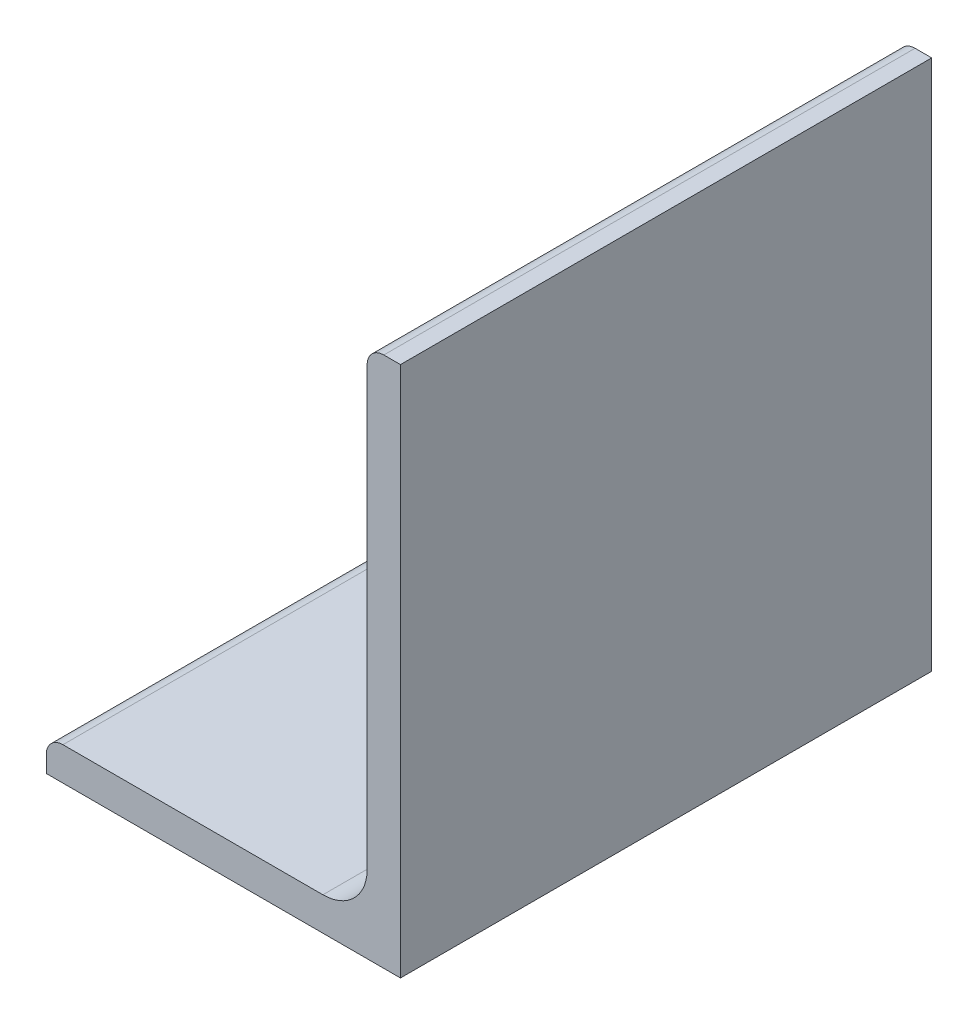
ISO-10303-21;
HEADER;
FILE_DESCRIPTION(('STEP AP214'),'2;1');
FILE_NAME('part.step','',(''),(''),'','','');
FILE_SCHEMA(('AUTOMOTIVE_DESIGN { 1 0 10303 214 1 1 1 1 }'));
ENDSEC;
DATA;
#1=APPLICATION_CONTEXT('core data for automotive mechanical design processes');
#2=APPLICATION_PROTOCOL_DEFINITION('international standard','automotive_design',2000,#1);
#3=PRODUCT_CONTEXT('',#1,'mechanical');
#4=PRODUCT('Part','Part','',(#3));
#5=PRODUCT_RELATED_PRODUCT_CATEGORY('part','',(#4));
#6=PRODUCT_DEFINITION_FORMATION('','',#4);
#7=PRODUCT_DEFINITION_CONTEXT('part definition',#1,'design');
#8=PRODUCT_DEFINITION('design','',#6,#7);
#9=PRODUCT_DEFINITION_SHAPE('','',#8);
#10=(LENGTH_UNIT() NAMED_UNIT(*) SI_UNIT(.MILLI.,.METRE.));
#11=(NAMED_UNIT(*) PLANE_ANGLE_UNIT() SI_UNIT($,.RADIAN.));
#12=(NAMED_UNIT(*) SI_UNIT($,.STERADIAN.) SOLID_ANGLE_UNIT());
#13=UNCERTAINTY_MEASURE_WITH_UNIT(LENGTH_MEASURE(1.E-05),#10,'distance_accuracy_value','');
#14=(GEOMETRIC_REPRESENTATION_CONTEXT(3) GLOBAL_UNCERTAINTY_ASSIGNED_CONTEXT((#13)) GLOBAL_UNIT_ASSIGNED_CONTEXT((#10,
#11,#12)) REPRESENTATION_CONTEXT('',''));
#15=CARTESIAN_POINT('',(0.,0.,0.));
#16=DIRECTION('',(0.,0.,1.));
#17=DIRECTION('',(1.,0.,0.));
#18=AXIS2_PLACEMENT_3D('',#15,#16,#17);
#19=CARTESIAN_POINT('',(-25.4,2.3876,38.1));
#20=DIRECTION('',(1.,0.,0.));
#21=DIRECTION('',(0.,0.,-1.));
#22=AXIS2_PLACEMENT_3D('',#19,#20,#21);
#23=PLANE('',#22);
#24=DIRECTION('',(0.,-1.,0.));
#25=VECTOR('',#24,1.);
#26=CARTESIAN_POINT('',(-25.4,2.3876,-38.1));
#27=LINE('',#26,#25);
#28=CARTESIAN_POINT('',(-25.4,2.3876,-38.1));
#29=VERTEX_POINT('',#28);
#30=CARTESIAN_POINT('',(-25.4,0.,-38.1));
#31=VERTEX_POINT('',#30);
#32=EDGE_CURVE('E146',#29,#31,#27,.T.);
#33=ORIENTED_EDGE('',*,*,#32,.T.);
#34=DIRECTION('',(0.,0.,-1.));
#35=VECTOR('',#34,1.);
#36=CARTESIAN_POINT('',(-25.4,0.,38.1));
#37=LINE('',#36,#35);
#38=CARTESIAN_POINT('',(-25.4,0.,38.1));
#39=VERTEX_POINT('',#38);
#40=EDGE_CURVE('E11',#39,#31,#37,.T.);
#41=ORIENTED_EDGE('',*,*,#40,.F.);
#42=DIRECTION('',(0.,-1.,0.));
#43=VECTOR('',#42,1.);
#44=CARTESIAN_POINT('',(-25.4,2.3876,38.1));
#45=LINE('',#44,#43);
#46=CARTESIAN_POINT('',(-25.4,2.3876,38.1));
#47=VERTEX_POINT('',#46);
#48=EDGE_CURVE('E171',#47,#39,#45,.T.);
#49=ORIENTED_EDGE('',*,*,#48,.F.);
#50=DIRECTION('',(0.,0.,-1.));
#51=VECTOR('',#50,1.);
#52=CARTESIAN_POINT('',(-25.4,2.3876,38.1));
#53=LINE('',#52,#51);
#54=EDGE_CURVE('E142',#47,#29,#53,.T.);
#55=ORIENTED_EDGE('',*,*,#54,.T.);
#56=EDGE_LOOP('',(#33,#41,#49,#55));
#57=FACE_BOUND('',#56,.T.);
#58=ADVANCED_FACE('F39',(#57),#23,.F.);
#59=CARTESIAN_POINT('',(-25.4,0.,38.1));
#60=DIRECTION('',(0.,1.,0.));
#61=DIRECTION('',(0.,0.,1.));
#62=AXIS2_PLACEMENT_3D('',#59,#60,#61);
#63=PLANE('',#62);
#64=DIRECTION('',(1.,0.,0.));
#65=VECTOR('',#64,1.);
#66=CARTESIAN_POINT('',(-25.4,0.,-38.1));
#67=LINE('',#66,#65);
#68=CARTESIAN_POINT('',(25.4,0.,-38.1));
#69=VERTEX_POINT('',#68);
#70=EDGE_CURVE('E150',#31,#69,#67,.T.);
#71=ORIENTED_EDGE('',*,*,#70,.T.);
#72=DIRECTION('',(0.,0.,-1.));
#73=VECTOR('',#72,1.);
#74=CARTESIAN_POINT('',(25.4,0.,38.1));
#75=LINE('',#74,#73);
#76=CARTESIAN_POINT('',(25.4,0.,38.1));
#77=VERTEX_POINT('',#76);
#78=EDGE_CURVE('E48',#77,#69,#75,.T.);
#79=ORIENTED_EDGE('',*,*,#78,.F.);
#80=DIRECTION('',(1.,0.,0.));
#81=VECTOR('',#80,1.);
#82=CARTESIAN_POINT('',(-25.4,0.,38.1));
#83=LINE('',#82,#81);
#84=EDGE_CURVE('E102',#39,#77,#83,.T.);
#85=ORIENTED_EDGE('',*,*,#84,.F.);
#86=ORIENTED_EDGE('',*,*,#40,.T.);
#87=EDGE_LOOP('',(#71,#79,#85,#86));
#88=FACE_BOUND('',#87,.T.);
#89=ADVANCED_FACE('F227',(#88),#63,.F.);
#90=CARTESIAN_POINT('',(25.4,0.,38.1));
#91=DIRECTION('',(-1.,0.,0.));
#92=DIRECTION('',(0.,0.,1.));
#93=AXIS2_PLACEMENT_3D('',#90,#91,#92);
#94=PLANE('',#93);
#95=DIRECTION('',(0.,1.,0.));
#96=VECTOR('',#95,1.);
#97=CARTESIAN_POINT('',(25.4,0.,-38.1));
#98=LINE('',#97,#96);
#99=CARTESIAN_POINT('',(25.4,76.2,-38.1));
#100=VERTEX_POINT('',#99);
#101=EDGE_CURVE('E153',#69,#100,#98,.T.);
#102=ORIENTED_EDGE('',*,*,#101,.T.);
#103=DIRECTION('',(0.,0.,-1.));
#104=VECTOR('',#103,1.);
#105=CARTESIAN_POINT('',(25.4,76.2,38.1));
#106=LINE('',#105,#104);
#107=CARTESIAN_POINT('',(25.4,76.2,38.1));
#108=VERTEX_POINT('',#107);
#109=EDGE_CURVE('E186',#108,#100,#106,.T.);
#110=ORIENTED_EDGE('',*,*,#109,.F.);
#111=DIRECTION('',(0.,1.,0.));
#112=VECTOR('',#111,1.);
#113=CARTESIAN_POINT('',(25.4,0.,38.1));
#114=LINE('',#113,#112);
#115=EDGE_CURVE('E196',#77,#108,#114,.T.);
#116=ORIENTED_EDGE('',*,*,#115,.F.);
#117=ORIENTED_EDGE('',*,*,#78,.T.);
#118=EDGE_LOOP('',(#102,#110,#116,#117));
#119=FACE_BOUND('',#118,.T.);
#120=ADVANCED_FACE('F194',(#119),#94,.F.);
#121=CARTESIAN_POINT('',(23.0124,76.2,38.1));
#122=DIRECTION('',(0.,-1.,0.));
#123=DIRECTION('',(0.,0.,-1.));
#124=AXIS2_PLACEMENT_3D('',#121,#122,#123);
#125=PLANE('',#124);
#126=DIRECTION('',(-1.,0.,0.));
#127=VECTOR('',#126,1.);
#128=CARTESIAN_POINT('',(23.0124,76.2,-38.1));
#129=LINE('',#128,#127);
#130=CARTESIAN_POINT('',(23.0124,76.2,-38.1));
#131=VERTEX_POINT('',#130);
#132=EDGE_CURVE('E156',#100,#131,#129,.T.);
#133=ORIENTED_EDGE('',*,*,#132,.T.);
#134=DIRECTION('',(0.,0.,-1.));
#135=VECTOR('',#134,1.);
#136=CARTESIAN_POINT('',(23.0124,76.2,38.1));
#137=LINE('',#136,#135);
#138=CARTESIAN_POINT('',(23.0124,76.2,38.1));
#139=VERTEX_POINT('',#138);
#140=EDGE_CURVE('E182',#139,#131,#137,.T.);
#141=ORIENTED_EDGE('',*,*,#140,.F.);
#142=DIRECTION('',(-1.,0.,0.));
#143=VECTOR('',#142,1.);
#144=CARTESIAN_POINT('',(23.0124,76.2,38.1));
#145=LINE('',#144,#143);
#146=EDGE_CURVE('E213',#108,#139,#145,.T.);
#147=ORIENTED_EDGE('',*,*,#146,.F.);
#148=ORIENTED_EDGE('',*,*,#109,.T.);
#149=EDGE_LOOP('',(#133,#141,#147,#148));
#150=FACE_BOUND('',#149,.T.);
#151=ADVANCED_FACE('F205',(#150),#125,.F.);
#152=CARTESIAN_POINT('',(23.0124,73.8124,38.1));
#153=DIRECTION('',(0.,0.,-1.));
#154=DIRECTION('',(-1.,0.,0.));
#155=AXIS2_PLACEMENT_3D('',#152,#153,#154);
#156=CYLINDRICAL_SURFACE('',#155,2.3876);
#157=CARTESIAN_POINT('',(23.0124,73.8124,-38.1));
#158=DIRECTION('',(0.,0.,1.));
#159=DIRECTION('',(-1.,0.,0.));
#160=AXIS2_PLACEMENT_3D('',#157,#158,#159);
#161=CIRCLE('',#160,2.3876);
#162=CARTESIAN_POINT('',(20.6248,73.8124,-38.1));
#163=VERTEX_POINT('',#162);
#164=EDGE_CURVE('E159',#131,#163,#161,.T.);
#165=ORIENTED_EDGE('',*,*,#164,.T.);
#166=DIRECTION('',(0.,0.,-1.));
#167=VECTOR('',#166,1.);
#168=CARTESIAN_POINT('',(20.6248,73.8124,38.1));
#169=LINE('',#168,#167);
#170=CARTESIAN_POINT('',(20.6248,73.8124,38.1));
#171=VERTEX_POINT('',#170);
#172=EDGE_CURVE('E178',#171,#163,#169,.T.);
#173=ORIENTED_EDGE('',*,*,#172,.F.);
#174=CARTESIAN_POINT('',(23.0124,73.8124,38.1));
#175=DIRECTION('',(0.,0.,1.));
#176=DIRECTION('',(-1.,0.,0.));
#177=AXIS2_PLACEMENT_3D('',#174,#175,#176);
#178=CIRCLE('',#177,2.3876);
#179=EDGE_CURVE('E211',#139,#171,#178,.T.);
#180=ORIENTED_EDGE('',*,*,#179,.F.);
#181=ORIENTED_EDGE('',*,*,#140,.T.);
#182=EDGE_LOOP('',(#165,#173,#180,#181));
#183=FACE_BOUND('',#182,.T.);
#184=ADVANCED_FACE('F209',(#183),#156,.T.);
#185=CARTESIAN_POINT('',(20.6248,73.8124,38.1));
#186=DIRECTION('',(1.,0.,0.));
#187=DIRECTION('',(0.,1.,0.));
#188=AXIS2_PLACEMENT_3D('',#185,#186,#187);
#189=PLANE('',#188);
#190=DIRECTION('',(0.,-1.,0.));
#191=VECTOR('',#190,1.);
#192=CARTESIAN_POINT('',(20.6248,73.8124,-38.1));
#193=LINE('',#192,#191);
#194=CARTESIAN_POINT('',(20.6248,11.1252,-38.1));
#195=VERTEX_POINT('',#194);
#196=EDGE_CURVE('E162',#163,#195,#193,.T.);
#197=ORIENTED_EDGE('',*,*,#196,.T.);
#198=DIRECTION('',(0.,0.,-1.));
#199=VECTOR('',#198,1.);
#200=CARTESIAN_POINT('',(20.6248,11.1252,38.1));
#201=LINE('',#200,#199);
#202=CARTESIAN_POINT('',(20.6248,11.1252,38.1));
#203=VERTEX_POINT('',#202);
#204=EDGE_CURVE('E135',#203,#195,#201,.T.);
#205=ORIENTED_EDGE('',*,*,#204,.F.);
#206=DIRECTION('',(0.,-1.,0.));
#207=VECTOR('',#206,1.);
#208=CARTESIAN_POINT('',(20.6248,73.8124,38.1));
#209=LINE('',#208,#207);
#210=EDGE_CURVE('E124',#171,#203,#209,.T.);
#211=ORIENTED_EDGE('',*,*,#210,.F.);
#212=ORIENTED_EDGE('',*,*,#172,.T.);
#213=EDGE_LOOP('',(#197,#205,#211,#212));
#214=FACE_BOUND('',#213,.T.);
#215=ADVANCED_FACE('F239',(#214),#189,.F.);
#216=CARTESIAN_POINT('',(14.2748,11.1252,38.1));
#217=DIRECTION('',(0.,0.,-1.));
#218=DIRECTION('',(-1.,0.,0.));
#219=AXIS2_PLACEMENT_3D('',#216,#217,#218);
#220=CYLINDRICAL_SURFACE('',#219,6.35);
#221=CARTESIAN_POINT('',(14.2748,11.1252,-38.1));
#222=DIRECTION('',(0.,0.,-1.));
#223=DIRECTION('',(-1.,0.,0.));
#224=AXIS2_PLACEMENT_3D('',#221,#222,#223);
#225=CIRCLE('',#224,6.35);
#226=CARTESIAN_POINT('',(14.2748,4.77520000000001,-38.1));
#227=VERTEX_POINT('',#226);
#228=EDGE_CURVE('E133',#195,#227,#225,.T.);
#229=ORIENTED_EDGE('',*,*,#228,.T.);
#230=DIRECTION('',(0.,0.,-1.));
#231=VECTOR('',#230,1.);
#232=CARTESIAN_POINT('',(14.2748,4.77520000000001,38.1));
#233=LINE('',#232,#231);
#234=CARTESIAN_POINT('',(14.2748,4.77520000000001,38.1));
#235=VERTEX_POINT('',#234);
#236=EDGE_CURVE('E130',#235,#227,#233,.T.);
#237=ORIENTED_EDGE('',*,*,#236,.F.);
#238=CARTESIAN_POINT('',(14.2748,11.1252,38.1));
#239=DIRECTION('',(0.,0.,-1.));
#240=DIRECTION('',(-1.,0.,0.));
#241=AXIS2_PLACEMENT_3D('',#238,#239,#240);
#242=CIRCLE('',#241,6.35);
#243=EDGE_CURVE('E118',#203,#235,#242,.T.);
#244=ORIENTED_EDGE('',*,*,#243,.F.);
#245=ORIENTED_EDGE('',*,*,#204,.T.);
#246=EDGE_LOOP('',(#229,#237,#244,#245));
#247=FACE_BOUND('',#246,.T.);
#248=ADVANCED_FACE('F131',(#247),#220,.F.);
#249=CARTESIAN_POINT('',(14.2748,4.7752,38.1));
#250=DIRECTION('',(0.,-1.,0.));
#251=DIRECTION('',(1.,0.,0.));
#252=AXIS2_PLACEMENT_3D('',#249,#250,#251);
#253=PLANE('',#252);
#254=DIRECTION('',(-1.,0.,0.));
#255=VECTOR('',#254,1.);
#256=CARTESIAN_POINT('',(14.2748,4.7752,-38.1));
#257=LINE('',#256,#255);
#258=CARTESIAN_POINT('',(-23.0124,4.7752,-38.1));
#259=VERTEX_POINT('',#258);
#260=EDGE_CURVE('E88',#227,#259,#257,.T.);
#261=ORIENTED_EDGE('',*,*,#260,.T.);
#262=DIRECTION('',(0.,0.,-1.));
#263=VECTOR('',#262,1.);
#264=CARTESIAN_POINT('',(-23.0124,4.7752,38.1));
#265=LINE('',#264,#263);
#266=CARTESIAN_POINT('',(-23.0124,4.7752,38.1));
#267=VERTEX_POINT('',#266);
#268=EDGE_CURVE('E136',#267,#259,#265,.T.);
#269=ORIENTED_EDGE('',*,*,#268,.F.);
#270=DIRECTION('',(-1.,0.,0.));
#271=VECTOR('',#270,1.);
#272=CARTESIAN_POINT('',(14.2748,4.7752,38.1));
#273=LINE('',#272,#271);
#274=EDGE_CURVE('E122',#235,#267,#273,.T.);
#275=ORIENTED_EDGE('',*,*,#274,.F.);
#276=ORIENTED_EDGE('',*,*,#236,.T.);
#277=EDGE_LOOP('',(#261,#269,#275,#276));
#278=FACE_BOUND('',#277,.T.);
#279=ADVANCED_FACE('F138',(#278),#253,.F.);
#280=CARTESIAN_POINT('',(-23.0124,2.3876,38.1));
#281=DIRECTION('',(0.,0.,-1.));
#282=DIRECTION('',(-1.,0.,0.));
#283=AXIS2_PLACEMENT_3D('',#280,#281,#282);
#284=CYLINDRICAL_SURFACE('',#283,2.3876);
#285=CARTESIAN_POINT('',(-23.0124,2.3876,-38.1));
#286=DIRECTION('',(0.,0.,1.));
#287=DIRECTION('',(-1.,0.,0.));
#288=AXIS2_PLACEMENT_3D('',#285,#286,#287);
#289=CIRCLE('',#288,2.3876);
#290=EDGE_CURVE('E94',#259,#29,#289,.T.);
#291=ORIENTED_EDGE('',*,*,#290,.T.);
#292=ORIENTED_EDGE('',*,*,#54,.F.);
#293=CARTESIAN_POINT('',(-23.0124,2.3876,38.1));
#294=DIRECTION('',(0.,0.,1.));
#295=DIRECTION('',(-1.,0.,0.));
#296=AXIS2_PLACEMENT_3D('',#293,#294,#295);
#297=CIRCLE('',#296,2.3876);
#298=EDGE_CURVE('E56',#267,#47,#297,.T.);
#299=ORIENTED_EDGE('',*,*,#298,.F.);
#300=ORIENTED_EDGE('',*,*,#268,.T.);
#301=EDGE_LOOP('',(#291,#292,#299,#300));
#302=FACE_BOUND('',#301,.T.);
#303=ADVANCED_FACE('F247',(#302),#284,.T.);
#304=CARTESIAN_POINT('',(23.0124,73.8124,38.1));
#305=DIRECTION('',(0.,0.,-1.));
#306=DIRECTION('',(-1.,0.,0.));
#307=AXIS2_PLACEMENT_3D('',#304,#305,#306);
#308=PLANE('',#307);
#309=ORIENTED_EDGE('',*,*,#48,.T.);
#310=ORIENTED_EDGE('',*,*,#84,.T.);
#311=ORIENTED_EDGE('',*,*,#115,.T.);
#312=ORIENTED_EDGE('',*,*,#146,.T.);
#313=ORIENTED_EDGE('',*,*,#179,.T.);
#314=ORIENTED_EDGE('',*,*,#210,.T.);
#315=ORIENTED_EDGE('',*,*,#243,.T.);
#316=ORIENTED_EDGE('',*,*,#274,.T.);
#317=ORIENTED_EDGE('',*,*,#298,.T.);
#318=EDGE_LOOP('',(#309,#310,#311,#312,#313,#314,#315,#316,#317));
#319=FACE_BOUND('',#318,.T.);
#320=ADVANCED_FACE('F120',(#319),#308,.F.);
#321=CARTESIAN_POINT('',(23.0124,73.8124,-38.1));
#322=DIRECTION('',(0.,0.,-1.));
#323=DIRECTION('',(-1.,0.,0.));
#324=AXIS2_PLACEMENT_3D('',#321,#322,#323);
#325=PLANE('',#324);
#326=ORIENTED_EDGE('',*,*,#32,.F.);
#327=ORIENTED_EDGE('',*,*,#290,.F.);
#328=ORIENTED_EDGE('',*,*,#260,.F.);
#329=ORIENTED_EDGE('',*,*,#228,.F.);
#330=ORIENTED_EDGE('',*,*,#196,.F.);
#331=ORIENTED_EDGE('',*,*,#164,.F.);
#332=ORIENTED_EDGE('',*,*,#132,.F.);
#333=ORIENTED_EDGE('',*,*,#101,.F.);
#334=ORIENTED_EDGE('',*,*,#70,.F.);
#335=EDGE_LOOP('',(#326,#327,#328,#329,#330,#331,#332,#333,#334));
#336=FACE_BOUND('',#335,.T.);
#337=ADVANCED_FACE('F200',(#336),#325,.T.);
#338=CLOSED_SHELL('',(#58,#89,#120,#151,#184,#215,#248,#279,#303,#320,#337));
#339=MANIFOLD_SOLID_BREP('B2',#338);
#340=ADVANCED_BREP_SHAPE_REPRESENTATION('',(#18,#339),#14);
#341=SHAPE_DEFINITION_REPRESENTATION(#9,#340);
ENDSEC;
END-ISO-10303-21;
